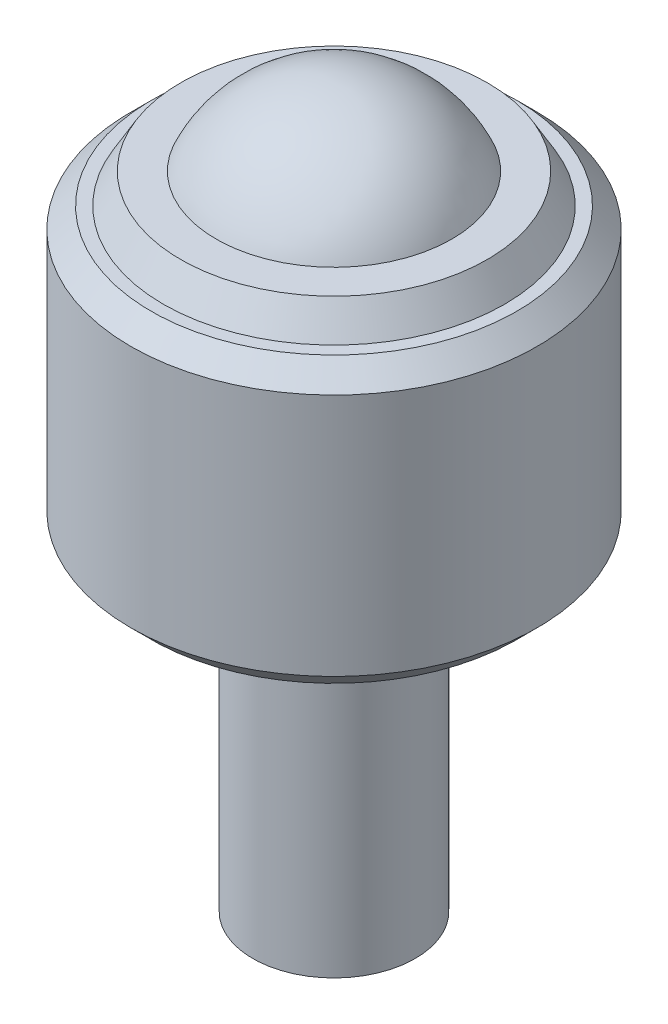
ISO-10303-21;
HEADER;
FILE_DESCRIPTION(('STEP AP214'),'2;1');
FILE_NAME('part.step','',(''),(''),'','','');
FILE_SCHEMA(('AUTOMOTIVE_DESIGN { 1 0 10303 214 1 1 1 1 }'));
ENDSEC;
DATA;
#1=APPLICATION_CONTEXT('core data for automotive mechanical design processes');
#2=APPLICATION_PROTOCOL_DEFINITION('international standard','automotive_design',2000,#1);
#3=PRODUCT_CONTEXT('',#1,'mechanical');
#4=PRODUCT('Part','Part','',(#3));
#5=PRODUCT_RELATED_PRODUCT_CATEGORY('part','',(#4));
#6=PRODUCT_DEFINITION_FORMATION('','',#4);
#7=PRODUCT_DEFINITION_CONTEXT('part definition',#1,'design');
#8=PRODUCT_DEFINITION('design','',#6,#7);
#9=PRODUCT_DEFINITION_SHAPE('','',#8);
#10=(LENGTH_UNIT() NAMED_UNIT(*) SI_UNIT(.MILLI.,.METRE.));
#11=(NAMED_UNIT(*) PLANE_ANGLE_UNIT() SI_UNIT($,.RADIAN.));
#12=(NAMED_UNIT(*) SI_UNIT($,.STERADIAN.) SOLID_ANGLE_UNIT());
#13=UNCERTAINTY_MEASURE_WITH_UNIT(LENGTH_MEASURE(1.E-05),#10,'distance_accuracy_value','');
#14=(GEOMETRIC_REPRESENTATION_CONTEXT(3) GLOBAL_UNCERTAINTY_ASSIGNED_CONTEXT((#13)) GLOBAL_UNIT_ASSIGNED_CONTEXT((#10,
#11,#12)) REPRESENTATION_CONTEXT('',''));
#15=CARTESIAN_POINT('',(0.,0.,0.));
#16=DIRECTION('',(0.,0.,1.));
#17=DIRECTION('',(1.,0.,0.));
#18=AXIS2_PLACEMENT_3D('',#15,#16,#17);
#19=CARTESIAN_POINT('',(-0.173972131852636,34.1746307519721,0.));
#20=DIRECTION('',(0.,-1.,0.));
#21=DIRECTION('',(1.,0.,0.));
#22=AXIS2_PLACEMENT_3D('',#19,#20,#21);
#23=SPHERICAL_SURFACE('',#22,6.35);
#24=CARTESIAN_POINT('',(-0.173972131852636,36.7546307519721,0.));
#25=DIRECTION('',(0.,-1.,0.));
#26=DIRECTION('',(0.,0.,-1.));
#27=AXIS2_PLACEMENT_3D('',#24,#25,#26);
#28=CIRCLE('',#27,5.80224956374681);
#29=CARTESIAN_POINT('',(-0.173972131852636,36.7546307519721,-5.80224956374681));
#30=VERTEX_POINT('',#29);
#31=EDGE_CURVE('E84',#30,#30,#28,.T.);
#32=ORIENTED_EDGE('',*,*,#31,.F.);
#33=EDGE_LOOP('',(#32));
#34=FACE_BOUND('',#33,.T.);
#35=ADVANCED_FACE('F41',(#34),#23,.T.);
#36=CARTESIAN_POINT('',(3.82602786814736,5.17463075197212,0.));
#37=DIRECTION('',(0.,-1.,0.));
#38=DIRECTION('',(0.,0.,-1.));
#39=AXIS2_PLACEMENT_3D('',#36,#37,#38);
#40=PLANE('',#39);
#41=CARTESIAN_POINT('',(-0.173972131852636,5.17463075197212,0.));
#42=DIRECTION('',(0.,-1.,0.));
#43=DIRECTION('',(0.,0.,-1.));
#44=AXIS2_PLACEMENT_3D('',#41,#42,#43);
#45=CIRCLE('',#44,4.);
#46=CARTESIAN_POINT('',(-0.173972131852636,5.17463075197212,-4.));
#47=VERTEX_POINT('',#46);
#48=EDGE_CURVE('E10',#47,#47,#45,.T.);
#49=ORIENTED_EDGE('',*,*,#48,.T.);
#50=EDGE_LOOP('',(#49));
#51=FACE_BOUND('',#50,.T.);
#52=ADVANCED_FACE('F93',(#51),#40,.T.);
#53=CARTESIAN_POINT('',(-0.173972131852636,0.,0.));
#54=DIRECTION('',(0.,-1.,0.));
#55=DIRECTION('',(0.,0.,-1.));
#56=AXIS2_PLACEMENT_3D('',#53,#54,#55);
#57=CYLINDRICAL_SURFACE('',#56,4.);
#58=CARTESIAN_POINT('',(-0.173972131852636,20.2746307519721,0.));
#59=DIRECTION('',(0.,-1.,0.));
#60=DIRECTION('',(0.,0.,-1.));
#61=AXIS2_PLACEMENT_3D('',#58,#59,#60);
#62=CIRCLE('',#61,4.);
#63=CARTESIAN_POINT('',(-0.173972131852636,20.2746307519721,-4.));
#64=VERTEX_POINT('',#63);
#65=EDGE_CURVE('E48',#64,#64,#62,.T.);
#66=ORIENTED_EDGE('',*,*,#65,.T.);
#67=EDGE_LOOP('',(#66));
#68=FACE_BOUND('',#67,.T.);
#69=ORIENTED_EDGE('',*,*,#48,.F.);
#70=EDGE_LOOP('',(#69));
#71=FACE_BOUND('',#70,.T.);
#72=ADVANCED_FACE('F97',(#68,#71),#57,.T.);
#73=CARTESIAN_POINT('',(-0.173972131852636,20.2746307519721,0.));
#74=DIRECTION('',(0.,-1.,0.));
#75=DIRECTION('',(0.,0.,-1.));
#76=AXIS2_PLACEMENT_3D('',#73,#74,#75);
#77=TOROIDAL_SURFACE('',#76,5.,1.);
#78=CARTESIAN_POINT('',(-0.173972131852636,21.2746307519721,0.));
#79=DIRECTION('',(0.,-1.,0.));
#80=DIRECTION('',(0.,0.,-1.));
#81=AXIS2_PLACEMENT_3D('',#78,#79,#80);
#82=CIRCLE('',#81,5.);
#83=CARTESIAN_POINT('',(-0.173972131852636,21.2746307519721,-5.));
#84=VERTEX_POINT('',#83);
#85=EDGE_CURVE('E53',#84,#84,#82,.T.);
#86=ORIENTED_EDGE('',*,*,#85,.T.);
#87=EDGE_LOOP('',(#86));
#88=FACE_BOUND('',#87,.T.);
#89=ORIENTED_EDGE('',*,*,#65,.F.);
#90=EDGE_LOOP('',(#89));
#91=FACE_BOUND('',#90,.T.);
#92=ADVANCED_FACE('F101',(#88,#91),#77,.F.);
#93=CARTESIAN_POINT('',(8.82602786814737,21.2746307519721,0.));
#94=DIRECTION('',(0.,-1.,0.));
#95=DIRECTION('',(0.,0.,-1.));
#96=AXIS2_PLACEMENT_3D('',#93,#94,#95);
#97=PLANE('',#96);
#98=CARTESIAN_POINT('',(-0.173972131852636,21.2746307519721,0.));
#99=DIRECTION('',(0.,-1.,0.));
#100=DIRECTION('',(0.,0.,-1.));
#101=AXIS2_PLACEMENT_3D('',#98,#99,#100);
#102=CIRCLE('',#101,9.);
#103=CARTESIAN_POINT('',(-0.173972131852636,21.2746307519721,-9.));
#104=VERTEX_POINT('',#103);
#105=EDGE_CURVE('E58',#104,#104,#102,.T.);
#106=ORIENTED_EDGE('',*,*,#105,.T.);
#107=EDGE_LOOP('',(#106));
#108=FACE_BOUND('',#107,.T.);
#109=ORIENTED_EDGE('',*,*,#85,.F.);
#110=EDGE_LOOP('',(#109));
#111=FACE_BOUND('',#110,.T.);
#112=ADVANCED_FACE('F106',(#108,#111),#97,.T.);
#113=CARTESIAN_POINT('',(-0.173972131852636,21.2746307519721,0.));
#114=DIRECTION('',(0.,1.,0.));
#115=DIRECTION('',(0.,0.,1.));
#116=AXIS2_PLACEMENT_3D('',#113,#114,#115);
#117=CONICAL_SURFACE('',#116,9.,0.785398163397447);
#118=CARTESIAN_POINT('',(-0.173972131852636,22.2746307519721,0.));
#119=DIRECTION('',(0.,-1.,0.));
#120=DIRECTION('',(0.,0.,-1.));
#121=AXIS2_PLACEMENT_3D('',#118,#119,#120);
#122=CIRCLE('',#121,10.);
#123=CARTESIAN_POINT('',(-0.173972131852636,22.2746307519721,-10.));
#124=VERTEX_POINT('',#123);
#125=EDGE_CURVE('E64',#124,#124,#122,.T.);
#126=ORIENTED_EDGE('',*,*,#125,.T.);
#127=EDGE_LOOP('',(#126));
#128=FACE_BOUND('',#127,.T.);
#129=ORIENTED_EDGE('',*,*,#105,.F.);
#130=EDGE_LOOP('',(#129));
#131=FACE_BOUND('',#130,.T.);
#132=ADVANCED_FACE('F110',(#128,#131),#117,.T.);
#133=CARTESIAN_POINT('',(-0.173972131852636,0.,0.));
#134=DIRECTION('',(0.,-1.,0.));
#135=DIRECTION('',(0.,0.,-1.));
#136=AXIS2_PLACEMENT_3D('',#133,#134,#135);
#137=CYLINDRICAL_SURFACE('',#136,10.);
#138=CARTESIAN_POINT('',(-0.173972131852636,34.2746307519721,0.));
#139=DIRECTION('',(0.,-1.,0.));
#140=DIRECTION('',(0.,0.,-1.));
#141=AXIS2_PLACEMENT_3D('',#138,#139,#140);
#142=CIRCLE('',#141,10.);
#143=CARTESIAN_POINT('',(-0.173972131852636,34.2746307519721,-10.));
#144=VERTEX_POINT('',#143);
#145=EDGE_CURVE('E68',#144,#144,#142,.T.);
#146=ORIENTED_EDGE('',*,*,#145,.T.);
#147=EDGE_LOOP('',(#146));
#148=FACE_BOUND('',#147,.T.);
#149=ORIENTED_EDGE('',*,*,#125,.F.);
#150=EDGE_LOOP('',(#149));
#151=FACE_BOUND('',#150,.T.);
#152=ADVANCED_FACE('F114',(#148,#151),#137,.T.);
#153=CARTESIAN_POINT('',(-0.173972131852636,34.2746307519721,0.));
#154=DIRECTION('',(0.,-1.,0.));
#155=DIRECTION('',(0.,0.,-1.));
#156=AXIS2_PLACEMENT_3D('',#153,#154,#155);
#157=CONICAL_SURFACE('',#156,10.,0.785398163397447);
#158=CARTESIAN_POINT('',(-0.173972131852636,35.2746307519721,0.));
#159=DIRECTION('',(0.,-1.,0.));
#160=DIRECTION('',(0.,0.,-1.));
#161=AXIS2_PLACEMENT_3D('',#158,#159,#160);
#162=CIRCLE('',#161,9.);
#163=CARTESIAN_POINT('',(-0.173972131852636,35.2746307519721,-9.));
#164=VERTEX_POINT('',#163);
#165=EDGE_CURVE('E72',#164,#164,#162,.T.);
#166=ORIENTED_EDGE('',*,*,#165,.T.);
#167=EDGE_LOOP('',(#166));
#168=FACE_BOUND('',#167,.T.);
#169=ORIENTED_EDGE('',*,*,#145,.F.);
#170=EDGE_LOOP('',(#169));
#171=FACE_BOUND('',#170,.T.);
#172=ADVANCED_FACE('F118',(#168,#171),#157,.T.);
#173=CARTESIAN_POINT('',(8.22602786814737,35.2746307519721,0.));
#174=DIRECTION('',(0.,1.,0.));
#175=DIRECTION('',(0.,0.,1.));
#176=AXIS2_PLACEMENT_3D('',#173,#174,#175);
#177=PLANE('',#176);
#178=CARTESIAN_POINT('',(-0.173972131852636,35.2746307519721,0.));
#179=DIRECTION('',(0.,-1.,0.));
#180=DIRECTION('',(0.,0.,-1.));
#181=AXIS2_PLACEMENT_3D('',#178,#179,#180);
#182=CIRCLE('',#181,8.4);
#183=CARTESIAN_POINT('',(-0.173972131852636,35.2746307519721,-8.4));
#184=VERTEX_POINT('',#183);
#185=EDGE_CURVE('E76',#184,#184,#182,.T.);
#186=ORIENTED_EDGE('',*,*,#185,.T.);
#187=EDGE_LOOP('',(#186));
#188=FACE_BOUND('',#187,.T.);
#189=ORIENTED_EDGE('',*,*,#165,.F.);
#190=EDGE_LOOP('',(#189));
#191=FACE_BOUND('',#190,.T.);
#192=ADVANCED_FACE('F122',(#188,#191),#177,.T.);
#193=CARTESIAN_POINT('',(-0.173972131852636,35.2746307519721,0.));
#194=DIRECTION('',(0.,-1.,0.));
#195=DIRECTION('',(0.,0.,-1.));
#196=AXIS2_PLACEMENT_3D('',#193,#194,#195);
#197=CONICAL_SURFACE('',#196,8.4,0.52333343838869);
#198=CARTESIAN_POINT('',(-0.173972131852636,36.7546307519721,0.));
#199=DIRECTION('',(0.,-1.,0.));
#200=DIRECTION('',(0.,0.,-1.));
#201=AXIS2_PLACEMENT_3D('',#198,#199,#200);
#202=CIRCLE('',#201,7.54604512017282);
#203=CARTESIAN_POINT('',(-0.173972131852636,36.7546307519721,-7.54604512017282));
#204=VERTEX_POINT('',#203);
#205=EDGE_CURVE('E80',#204,#204,#202,.T.);
#206=ORIENTED_EDGE('',*,*,#205,.T.);
#207=EDGE_LOOP('',(#206));
#208=FACE_BOUND('',#207,.T.);
#209=ORIENTED_EDGE('',*,*,#185,.F.);
#210=EDGE_LOOP('',(#209));
#211=FACE_BOUND('',#210,.T.);
#212=ADVANCED_FACE('F126',(#208,#211),#197,.T.);
#213=CARTESIAN_POINT('',(5.62827743189417,36.7546307519721,0.));
#214=DIRECTION('',(0.,1.,0.));
#215=DIRECTION('',(0.,0.,1.));
#216=AXIS2_PLACEMENT_3D('',#213,#214,#215);
#217=PLANE('',#216);
#218=ORIENTED_EDGE('',*,*,#31,.T.);
#219=EDGE_LOOP('',(#218));
#220=FACE_BOUND('',#219,.T.);
#221=ORIENTED_EDGE('',*,*,#205,.F.);
#222=EDGE_LOOP('',(#221));
#223=FACE_BOUND('',#222,.T.);
#224=ADVANCED_FACE('F89',(#220,#223),#217,.T.);
#225=CLOSED_SHELL('',(#35,#52,#72,#92,#112,#132,#152,#172,#192,#212,#224));
#226=MANIFOLD_SOLID_BREP('B2',#225);
#227=ADVANCED_BREP_SHAPE_REPRESENTATION('',(#18,#226),#14);
#228=SHAPE_DEFINITION_REPRESENTATION(#9,#227);
ENDSEC;
END-ISO-10303-21;
